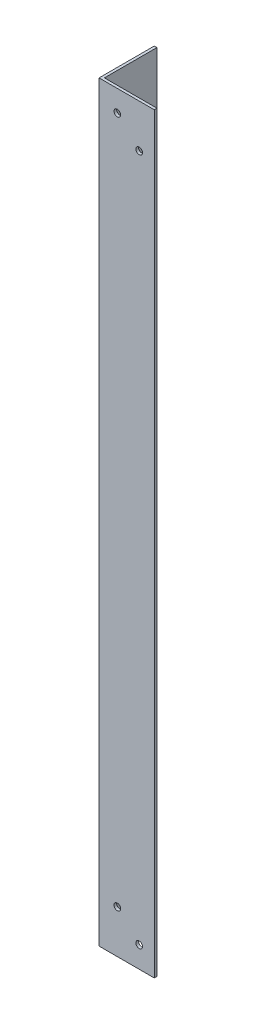
ISO-10303-21;
HEADER;
FILE_DESCRIPTION(('STEP AP214'),'2;1');
FILE_NAME('part.step','',(''),(''),'','','');
FILE_SCHEMA(('AUTOMOTIVE_DESIGN { 1 0 10303 214 1 1 1 1 }'));
ENDSEC;
DATA;
#1=APPLICATION_CONTEXT('core data for automotive mechanical design processes');
#2=APPLICATION_PROTOCOL_DEFINITION('international standard','automotive_design',2000,#1);
#3=PRODUCT_CONTEXT('',#1,'mechanical');
#4=PRODUCT('Part','Part','',(#3));
#5=PRODUCT_RELATED_PRODUCT_CATEGORY('part','',(#4));
#6=PRODUCT_DEFINITION_FORMATION('','',#4);
#7=PRODUCT_DEFINITION_CONTEXT('part definition',#1,'design');
#8=PRODUCT_DEFINITION('design','',#6,#7);
#9=PRODUCT_DEFINITION_SHAPE('','',#8);
#10=(LENGTH_UNIT() NAMED_UNIT(*) SI_UNIT(.MILLI.,.METRE.));
#11=(NAMED_UNIT(*) PLANE_ANGLE_UNIT() SI_UNIT($,.RADIAN.));
#12=(NAMED_UNIT(*) SI_UNIT($,.STERADIAN.) SOLID_ANGLE_UNIT());
#13=UNCERTAINTY_MEASURE_WITH_UNIT(LENGTH_MEASURE(1.E-05),#10,'distance_accuracy_value','');
#14=(GEOMETRIC_REPRESENTATION_CONTEXT(3) GLOBAL_UNCERTAINTY_ASSIGNED_CONTEXT((#13)) GLOBAL_UNIT_ASSIGNED_CONTEXT((#10,
#11,#12)) REPRESENTATION_CONTEXT('',''));
#15=CARTESIAN_POINT('',(0.,0.,0.));
#16=DIRECTION('',(0.,0.,1.));
#17=DIRECTION('',(1.,0.,0.));
#18=AXIS2_PLACEMENT_3D('',#15,#16,#17);
#19=CARTESIAN_POINT('',(0.,340.5,0.));
#20=DIRECTION('',(0.,0.,-1.));
#21=DIRECTION('',(-1.,0.,0.));
#22=AXIS2_PLACEMENT_3D('',#19,#20,#21);
#23=PLANE('',#22);
#24=CARTESIAN_POINT('',(18.17,9.63700000000001,0.));
#25=DIRECTION('',(0.,0.,-1.));
#26=DIRECTION('',(1.,0.,0.));
#27=AXIS2_PLACEMENT_3D('',#24,#25,#26);
#28=CIRCLE('',#27,1.5);
#29=CARTESIAN_POINT('',(19.67,9.63700000000001,0.));
#30=VERTEX_POINT('',#29);
#31=EDGE_CURVE('E163',#30,#30,#28,.T.);
#32=ORIENTED_EDGE('',*,*,#31,.T.);
#33=EDGE_LOOP('',(#32));
#34=FACE_BOUND('',#33,.T.);
#35=CARTESIAN_POINT('',(8.27050506338833,330.863,0.));
#36=DIRECTION('',(0.,0.,-1.));
#37=DIRECTION('',(1.,0.,0.));
#38=AXIS2_PLACEMENT_3D('',#35,#36,#37);
#39=CIRCLE('',#38,1.5);
#40=CARTESIAN_POINT('',(9.77050506338833,330.863,0.));
#41=VERTEX_POINT('',#40);
#42=EDGE_CURVE('E167',#41,#41,#39,.T.);
#43=ORIENTED_EDGE('',*,*,#42,.T.);
#44=EDGE_LOOP('',(#43));
#45=FACE_BOUND('',#44,.T.);
#46=CARTESIAN_POINT('',(18.17,320.963505063388,0.));
#47=DIRECTION('',(0.,0.,-1.));
#48=DIRECTION('',(1.,0.,0.));
#49=AXIS2_PLACEMENT_3D('',#46,#47,#48);
#50=CIRCLE('',#49,1.5);
#51=CARTESIAN_POINT('',(19.67,320.963505063388,0.));
#52=VERTEX_POINT('',#51);
#53=EDGE_CURVE('E171',#52,#52,#50,.T.);
#54=ORIENTED_EDGE('',*,*,#53,.T.);
#55=EDGE_LOOP('',(#54));
#56=FACE_BOUND('',#55,.T.);
#57=CARTESIAN_POINT('',(8.27050506338833,19.5364949366117,0.));
#58=DIRECTION('',(0.,0.,-1.));
#59=DIRECTION('',(1.,0.,0.));
#60=AXIS2_PLACEMENT_3D('',#57,#58,#59);
#61=CIRCLE('',#60,1.5);
#62=CARTESIAN_POINT('',(9.77050506338833,19.5364949366117,0.));
#63=VERTEX_POINT('',#62);
#64=EDGE_CURVE('E122',#63,#63,#61,.T.);
#65=ORIENTED_EDGE('',*,*,#64,.T.);
#66=EDGE_LOOP('',(#65));
#67=FACE_BOUND('',#66,.T.);
#68=DIRECTION('',(1.,0.,0.));
#69=VECTOR('',#68,1.);
#70=CARTESIAN_POINT('',(0.,0.,0.));
#71=LINE('',#70,#69);
#72=CARTESIAN_POINT('',(0.,0.,0.));
#73=VERTEX_POINT('',#72);
#74=CARTESIAN_POINT('',(25.,0.,0.));
#75=VERTEX_POINT('',#74);
#76=EDGE_CURVE('E118',#73,#75,#71,.T.);
#77=ORIENTED_EDGE('',*,*,#76,.T.);
#78=DIRECTION('',(0.,-1.,0.));
#79=VECTOR('',#78,1.);
#80=CARTESIAN_POINT('',(25.,340.5,0.));
#81=LINE('',#80,#79);
#82=CARTESIAN_POINT('',(25.,340.5,0.));
#83=VERTEX_POINT('',#82);
#84=EDGE_CURVE('E11',#83,#75,#81,.T.);
#85=ORIENTED_EDGE('',*,*,#84,.F.);
#86=DIRECTION('',(1.,0.,0.));
#87=VECTOR('',#86,1.);
#88=CARTESIAN_POINT('',(0.,340.5,0.));
#89=LINE('',#88,#87);
#90=CARTESIAN_POINT('',(0.,340.5,0.));
#91=VERTEX_POINT('',#90);
#92=EDGE_CURVE('E129',#91,#83,#89,.T.);
#93=ORIENTED_EDGE('',*,*,#92,.F.);
#94=DIRECTION('',(0.,-1.,0.));
#95=VECTOR('',#94,1.);
#96=CARTESIAN_POINT('',(0.,340.5,0.));
#97=LINE('',#96,#95);
#98=EDGE_CURVE('E114',#91,#73,#97,.T.);
#99=ORIENTED_EDGE('',*,*,#98,.T.);
#100=EDGE_LOOP('',(#77,#85,#93,#99));
#101=FACE_BOUND('',#100,.T.);
#102=ADVANCED_FACE('F34',(#34,#45,#56,#67,#101),#23,.F.);
#103=CARTESIAN_POINT('',(25.,340.5,0.));
#104=DIRECTION('',(-1.,0.,0.));
#105=DIRECTION('',(0.,0.,1.));
#106=AXIS2_PLACEMENT_3D('',#103,#104,#105);
#107=PLANE('',#106);
#108=DIRECTION('',(0.,0.,-1.));
#109=VECTOR('',#108,1.);
#110=CARTESIAN_POINT('',(25.,0.,0.));
#111=LINE('',#110,#109);
#112=CARTESIAN_POINT('',(25.,0.,-1.2));
#113=VERTEX_POINT('',#112);
#114=EDGE_CURVE('E121',#75,#113,#111,.T.);
#115=ORIENTED_EDGE('',*,*,#114,.T.);
#116=DIRECTION('',(0.,-1.,0.));
#117=VECTOR('',#116,1.);
#118=CARTESIAN_POINT('',(25.,340.5,-1.2));
#119=LINE('',#118,#117);
#120=CARTESIAN_POINT('',(25.,340.5,-1.2));
#121=VERTEX_POINT('',#120);
#122=EDGE_CURVE('E42',#121,#113,#119,.T.);
#123=ORIENTED_EDGE('',*,*,#122,.F.);
#124=DIRECTION('',(0.,0.,-1.));
#125=VECTOR('',#124,1.);
#126=CARTESIAN_POINT('',(25.,340.5,0.));
#127=LINE('',#126,#125);
#128=EDGE_CURVE('E87',#83,#121,#127,.T.);
#129=ORIENTED_EDGE('',*,*,#128,.F.);
#130=ORIENTED_EDGE('',*,*,#84,.T.);
#131=EDGE_LOOP('',(#115,#123,#129,#130));
#132=FACE_BOUND('',#131,.T.);
#133=ADVANCED_FACE('F153',(#132),#107,.F.);
#134=CARTESIAN_POINT('',(1.2,340.5,-1.2));
#135=DIRECTION('',(0.,0.,1.));
#136=DIRECTION('',(1.,0.,0.));
#137=AXIS2_PLACEMENT_3D('',#134,#135,#136);
#138=PLANE('',#137);
#139=CARTESIAN_POINT('',(18.17,9.63700000000001,-1.2));
#140=DIRECTION('',(0.,0.,-1.));
#141=DIRECTION('',(1.,0.,0.));
#142=AXIS2_PLACEMENT_3D('',#139,#140,#141);
#143=CIRCLE('',#142,1.5);
#144=CARTESIAN_POINT('',(19.67,9.63700000000001,-1.2));
#145=VERTEX_POINT('',#144);
#146=EDGE_CURVE('E186',#145,#145,#143,.T.);
#147=ORIENTED_EDGE('',*,*,#146,.F.);
#148=EDGE_LOOP('',(#147));
#149=FACE_BOUND('',#148,.T.);
#150=CARTESIAN_POINT('',(8.27050506338833,330.863,-1.2));
#151=DIRECTION('',(0.,0.,-1.));
#152=DIRECTION('',(1.,0.,0.));
#153=AXIS2_PLACEMENT_3D('',#150,#151,#152);
#154=CIRCLE('',#153,1.5);
#155=CARTESIAN_POINT('',(9.77050506338833,330.863,-1.2));
#156=VERTEX_POINT('',#155);
#157=EDGE_CURVE('E180',#156,#156,#154,.T.);
#158=ORIENTED_EDGE('',*,*,#157,.F.);
#159=EDGE_LOOP('',(#158));
#160=FACE_BOUND('',#159,.T.);
#161=CARTESIAN_POINT('',(18.17,320.963505063388,-1.2));
#162=DIRECTION('',(0.,0.,-1.));
#163=DIRECTION('',(1.,0.,0.));
#164=AXIS2_PLACEMENT_3D('',#161,#162,#163);
#165=CIRCLE('',#164,1.5);
#166=CARTESIAN_POINT('',(19.67,320.963505063388,-1.2));
#167=VERTEX_POINT('',#166);
#168=EDGE_CURVE('E190',#167,#167,#165,.T.);
#169=ORIENTED_EDGE('',*,*,#168,.F.);
#170=EDGE_LOOP('',(#169));
#171=FACE_BOUND('',#170,.T.);
#172=CARTESIAN_POINT('',(8.27050506338833,19.5364949366117,-1.2));
#173=DIRECTION('',(0.,0.,-1.));
#174=DIRECTION('',(1.,0.,0.));
#175=AXIS2_PLACEMENT_3D('',#172,#173,#174);
#176=CIRCLE('',#175,1.5);
#177=CARTESIAN_POINT('',(9.77050506338833,19.5364949366117,-1.2));
#178=VERTEX_POINT('',#177);
#179=EDGE_CURVE('E175',#178,#178,#176,.T.);
#180=ORIENTED_EDGE('',*,*,#179,.F.);
#181=EDGE_LOOP('',(#180));
#182=FACE_BOUND('',#181,.T.);
#183=DIRECTION('',(-1.,0.,0.));
#184=VECTOR('',#183,1.);
#185=CARTESIAN_POINT('',(1.2,0.,-1.2));
#186=LINE('',#185,#184);
#187=CARTESIAN_POINT('',(1.2,0.,-1.2));
#188=VERTEX_POINT('',#187);
#189=EDGE_CURVE('E124',#113,#188,#186,.T.);
#190=ORIENTED_EDGE('',*,*,#189,.T.);
#191=DIRECTION('',(0.,-1.,0.));
#192=VECTOR('',#191,1.);
#193=CARTESIAN_POINT('',(1.2,340.5,-1.2));
#194=LINE('',#193,#192);
#195=CARTESIAN_POINT('',(1.2,340.5,-1.2));
#196=VERTEX_POINT('',#195);
#197=EDGE_CURVE('E109',#196,#188,#194,.T.);
#198=ORIENTED_EDGE('',*,*,#197,.F.);
#199=DIRECTION('',(-1.,0.,0.));
#200=VECTOR('',#199,1.);
#201=CARTESIAN_POINT('',(1.2,340.5,-1.2));
#202=LINE('',#201,#200);
#203=EDGE_CURVE('E100',#121,#196,#202,.T.);
#204=ORIENTED_EDGE('',*,*,#203,.F.);
#205=ORIENTED_EDGE('',*,*,#122,.T.);
#206=EDGE_LOOP('',(#190,#198,#204,#205));
#207=FACE_BOUND('',#206,.T.);
#208=ADVANCED_FACE('F135',(#149,#160,#171,#182,#207),#138,.F.);
#209=CARTESIAN_POINT('',(1.2,340.5,-25.));
#210=DIRECTION('',(-1.,0.,0.));
#211=DIRECTION('',(0.,0.,1.));
#212=AXIS2_PLACEMENT_3D('',#209,#210,#211);
#213=PLANE('',#212);
#214=DIRECTION('',(0.,0.,-1.));
#215=VECTOR('',#214,1.);
#216=CARTESIAN_POINT('',(1.2,0.,-25.));
#217=LINE('',#216,#215);
#218=CARTESIAN_POINT('',(1.2,0.,-25.));
#219=VERTEX_POINT('',#218);
#220=EDGE_CURVE('E108',#188,#219,#217,.T.);
#221=ORIENTED_EDGE('',*,*,#220,.T.);
#222=DIRECTION('',(0.,-1.,0.));
#223=VECTOR('',#222,1.);
#224=CARTESIAN_POINT('',(1.2,340.5,-25.));
#225=LINE('',#224,#223);
#226=CARTESIAN_POINT('',(1.2,340.5,-25.));
#227=VERTEX_POINT('',#226);
#228=EDGE_CURVE('E105',#227,#219,#225,.T.);
#229=ORIENTED_EDGE('',*,*,#228,.F.);
#230=DIRECTION('',(0.,0.,-1.));
#231=VECTOR('',#230,1.);
#232=CARTESIAN_POINT('',(1.2,340.5,-25.));
#233=LINE('',#232,#231);
#234=EDGE_CURVE('E94',#196,#227,#233,.T.);
#235=ORIENTED_EDGE('',*,*,#234,.F.);
#236=ORIENTED_EDGE('',*,*,#197,.T.);
#237=EDGE_LOOP('',(#221,#229,#235,#236));
#238=FACE_BOUND('',#237,.T.);
#239=ADVANCED_FACE('F106',(#238),#213,.F.);
#240=CARTESIAN_POINT('',(0.,340.5,-25.));
#241=DIRECTION('',(0.,0.,1.));
#242=DIRECTION('',(1.,0.,0.));
#243=AXIS2_PLACEMENT_3D('',#240,#241,#242);
#244=PLANE('',#243);
#245=DIRECTION('',(-1.,0.,0.));
#246=VECTOR('',#245,1.);
#247=CARTESIAN_POINT('',(0.,0.,-25.));
#248=LINE('',#247,#246);
#249=CARTESIAN_POINT('',(0.,0.,-25.));
#250=VERTEX_POINT('',#249);
#251=EDGE_CURVE('E73',#219,#250,#248,.T.);
#252=ORIENTED_EDGE('',*,*,#251,.T.);
#253=DIRECTION('',(0.,-1.,0.));
#254=VECTOR('',#253,1.);
#255=CARTESIAN_POINT('',(0.,340.5,-25.));
#256=LINE('',#255,#254);
#257=CARTESIAN_POINT('',(0.,340.5,-25.));
#258=VERTEX_POINT('',#257);
#259=EDGE_CURVE('E110',#258,#250,#256,.T.);
#260=ORIENTED_EDGE('',*,*,#259,.F.);
#261=DIRECTION('',(-1.,0.,0.));
#262=VECTOR('',#261,1.);
#263=CARTESIAN_POINT('',(0.,340.5,-25.));
#264=LINE('',#263,#262);
#265=EDGE_CURVE('E98',#227,#258,#264,.T.);
#266=ORIENTED_EDGE('',*,*,#265,.F.);
#267=ORIENTED_EDGE('',*,*,#228,.T.);
#268=EDGE_LOOP('',(#252,#260,#266,#267));
#269=FACE_BOUND('',#268,.T.);
#270=ADVANCED_FACE('F112',(#269),#244,.F.);
#271=CARTESIAN_POINT('',(0.,340.5,0.));
#272=DIRECTION('',(1.,0.,0.));
#273=DIRECTION('',(0.,0.,-1.));
#274=AXIS2_PLACEMENT_3D('',#271,#272,#273);
#275=PLANE('',#274);
#276=DIRECTION('',(0.,0.,1.));
#277=VECTOR('',#276,1.);
#278=CARTESIAN_POINT('',(0.,0.,0.));
#279=LINE('',#278,#277);
#280=EDGE_CURVE('E79',#250,#73,#279,.T.);
#281=ORIENTED_EDGE('',*,*,#280,.T.);
#282=ORIENTED_EDGE('',*,*,#98,.F.);
#283=DIRECTION('',(0.,0.,1.));
#284=VECTOR('',#283,1.);
#285=CARTESIAN_POINT('',(0.,340.5,0.));
#286=LINE('',#285,#284);
#287=EDGE_CURVE('E50',#258,#91,#286,.T.);
#288=ORIENTED_EDGE('',*,*,#287,.F.);
#289=ORIENTED_EDGE('',*,*,#259,.T.);
#290=EDGE_LOOP('',(#281,#282,#288,#289));
#291=FACE_BOUND('',#290,.T.);
#292=ADVANCED_FACE('F142',(#291),#275,.F.);
#293=CARTESIAN_POINT('',(0.,340.5,0.));
#294=DIRECTION('',(0.,1.,0.));
#295=DIRECTION('',(0.,0.,1.));
#296=AXIS2_PLACEMENT_3D('',#293,#294,#295);
#297=PLANE('',#296);
#298=ORIENTED_EDGE('',*,*,#92,.T.);
#299=ORIENTED_EDGE('',*,*,#128,.T.);
#300=ORIENTED_EDGE('',*,*,#203,.T.);
#301=ORIENTED_EDGE('',*,*,#234,.T.);
#302=ORIENTED_EDGE('',*,*,#265,.T.);
#303=ORIENTED_EDGE('',*,*,#287,.T.);
#304=EDGE_LOOP('',(#298,#299,#300,#301,#302,#303));
#305=FACE_BOUND('',#304,.T.);
#306=ADVANCED_FACE('F96',(#305),#297,.T.);
#307=CARTESIAN_POINT('',(0.,0.,0.));
#308=DIRECTION('',(0.,1.,0.));
#309=DIRECTION('',(0.,0.,1.));
#310=AXIS2_PLACEMENT_3D('',#307,#308,#309);
#311=PLANE('',#310);
#312=ORIENTED_EDGE('',*,*,#76,.F.);
#313=ORIENTED_EDGE('',*,*,#280,.F.);
#314=ORIENTED_EDGE('',*,*,#251,.F.);
#315=ORIENTED_EDGE('',*,*,#220,.F.);
#316=ORIENTED_EDGE('',*,*,#189,.F.);
#317=ORIENTED_EDGE('',*,*,#114,.F.);
#318=EDGE_LOOP('',(#312,#313,#314,#315,#316,#317));
#319=FACE_BOUND('',#318,.T.);
#320=ADVANCED_FACE('F138',(#319),#311,.F.);
#321=CARTESIAN_POINT('',(8.27050506338833,19.5364949366117,0.));
#322=DIRECTION('',(0.,0.,-1.));
#323=DIRECTION('',(-1.,0.,0.));
#324=AXIS2_PLACEMENT_3D('',#321,#322,#323);
#325=CYLINDRICAL_SURFACE('',#324,1.5);
#326=ORIENTED_EDGE('',*,*,#64,.F.);
#327=EDGE_LOOP('',(#326));
#328=FACE_BOUND('',#327,.T.);
#329=ORIENTED_EDGE('',*,*,#179,.T.);
#330=EDGE_LOOP('',(#329));
#331=FACE_BOUND('',#330,.T.);
#332=ADVANCED_FACE('F202',(#328,#331),#325,.F.);
#333=CARTESIAN_POINT('',(18.17,320.963505063388,0.));
#334=DIRECTION('',(0.,0.,-1.));
#335=DIRECTION('',(-1.,0.,0.));
#336=AXIS2_PLACEMENT_3D('',#333,#334,#335);
#337=CYLINDRICAL_SURFACE('',#336,1.5);
#338=ORIENTED_EDGE('',*,*,#53,.F.);
#339=EDGE_LOOP('',(#338));
#340=FACE_BOUND('',#339,.T.);
#341=ORIENTED_EDGE('',*,*,#168,.T.);
#342=EDGE_LOOP('',(#341));
#343=FACE_BOUND('',#342,.T.);
#344=ADVANCED_FACE('F195',(#340,#343),#337,.F.);
#345=CARTESIAN_POINT('',(8.27050506338833,330.863,0.));
#346=DIRECTION('',(0.,0.,-1.));
#347=DIRECTION('',(-1.,0.,0.));
#348=AXIS2_PLACEMENT_3D('',#345,#346,#347);
#349=CYLINDRICAL_SURFACE('',#348,1.5);
#350=ORIENTED_EDGE('',*,*,#42,.F.);
#351=EDGE_LOOP('',(#350));
#352=FACE_BOUND('',#351,.T.);
#353=ORIENTED_EDGE('',*,*,#157,.T.);
#354=EDGE_LOOP('',(#353));
#355=FACE_BOUND('',#354,.T.);
#356=ADVANCED_FACE('F209',(#352,#355),#349,.F.);
#357=CARTESIAN_POINT('',(18.17,9.63700000000001,0.));
#358=DIRECTION('',(0.,0.,-1.));
#359=DIRECTION('',(-1.,0.,0.));
#360=AXIS2_PLACEMENT_3D('',#357,#358,#359);
#361=CYLINDRICAL_SURFACE('',#360,1.5);
#362=ORIENTED_EDGE('',*,*,#31,.F.);
#363=EDGE_LOOP('',(#362));
#364=FACE_BOUND('',#363,.T.);
#365=ORIENTED_EDGE('',*,*,#146,.T.);
#366=EDGE_LOOP('',(#365));
#367=FACE_BOUND('',#366,.T.);
#368=ADVANCED_FACE('F215',(#364,#367),#361,.F.);
#369=CLOSED_SHELL('',(#102,#133,#208,#239,#270,#292,#306,#320,#332,#344,#356,#368));
#370=MANIFOLD_SOLID_BREP('B2',#369);
#371=ADVANCED_BREP_SHAPE_REPRESENTATION('',(#18,#370),#14);
#372=SHAPE_DEFINITION_REPRESENTATION(#9,#371);
ENDSEC;
END-ISO-10303-21;
